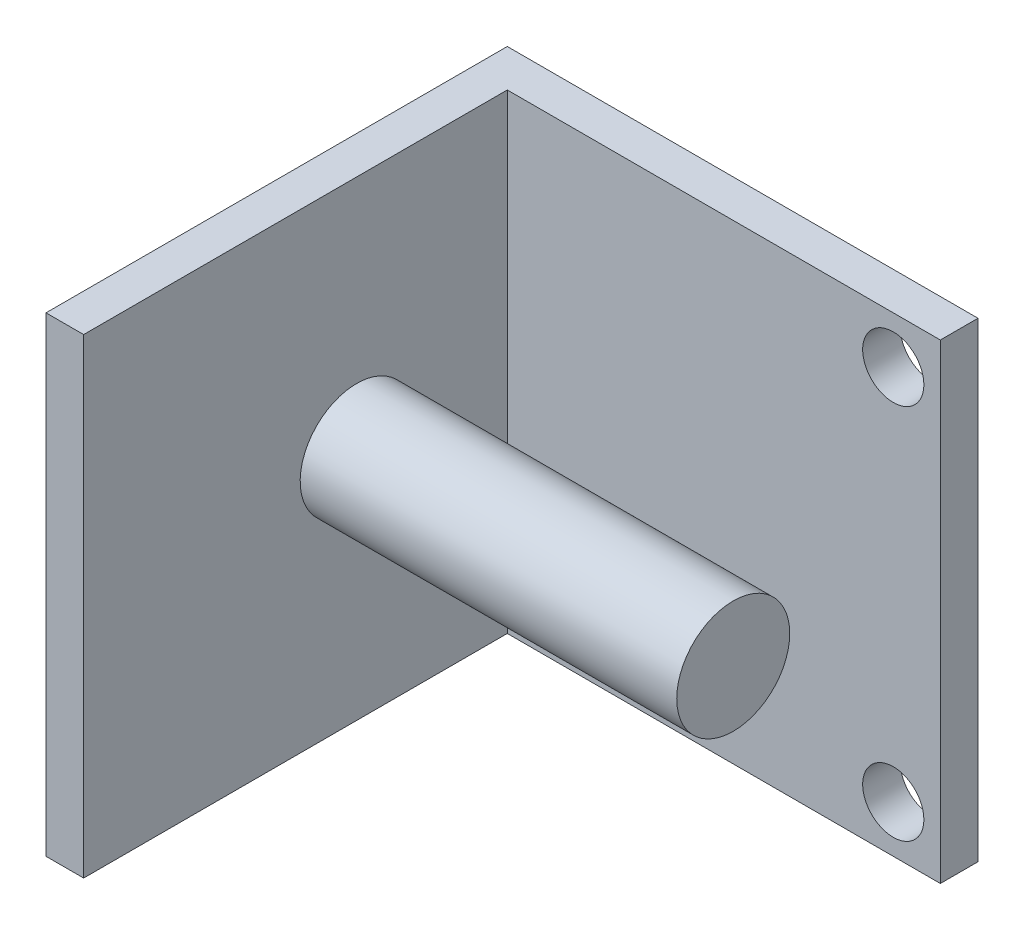
ISO-10303-21;
HEADER;
FILE_DESCRIPTION(('STEP AP214'),'2;1');
FILE_NAME('part.step','',(''),(''),'','','');
FILE_SCHEMA(('AUTOMOTIVE_DESIGN { 1 0 10303 214 1 1 1 1 }'));
ENDSEC;
DATA;
#1=APPLICATION_CONTEXT('core data for automotive mechanical design processes');
#2=APPLICATION_PROTOCOL_DEFINITION('international standard','automotive_design',2000,#1);
#3=PRODUCT_CONTEXT('',#1,'mechanical');
#4=PRODUCT('Part','Part','',(#3));
#5=PRODUCT_RELATED_PRODUCT_CATEGORY('part','',(#4));
#6=PRODUCT_DEFINITION_FORMATION('','',#4);
#7=PRODUCT_DEFINITION_CONTEXT('part definition',#1,'design');
#8=PRODUCT_DEFINITION('design','',#6,#7);
#9=PRODUCT_DEFINITION_SHAPE('','',#8);
#10=(LENGTH_UNIT() NAMED_UNIT(*) SI_UNIT(.MILLI.,.METRE.));
#11=(NAMED_UNIT(*) PLANE_ANGLE_UNIT() SI_UNIT($,.RADIAN.));
#12=(NAMED_UNIT(*) SI_UNIT($,.STERADIAN.) SOLID_ANGLE_UNIT());
#13=UNCERTAINTY_MEASURE_WITH_UNIT(LENGTH_MEASURE(1.E-05),#10,'distance_accuracy_value','');
#14=(GEOMETRIC_REPRESENTATION_CONTEXT(3) GLOBAL_UNCERTAINTY_ASSIGNED_CONTEXT((#13)) GLOBAL_UNIT_ASSIGNED_CONTEXT((#10,
#11,#12)) REPRESENTATION_CONTEXT('',''));
#15=CARTESIAN_POINT('',(0.,0.,0.));
#16=DIRECTION('',(0.,0.,1.));
#17=DIRECTION('',(1.,0.,0.));
#18=AXIS2_PLACEMENT_3D('',#15,#16,#17);
#19=CARTESIAN_POINT('',(-21.,25.,49.));
#20=DIRECTION('',(-1.,0.,0.));
#21=DIRECTION('',(0.,-1.,0.));
#22=AXIS2_PLACEMENT_3D('',#19,#20,#21);
#23=PLANE('',#22);
#24=DIRECTION('',(0.,1.,0.));
#25=VECTOR('',#24,1.);
#26=CARTESIAN_POINT('',(-21.,25.,4.));
#27=LINE('',#26,#25);
#28=CARTESIAN_POINT('',(-21.,-25.,4.));
#29=VERTEX_POINT('',#28);
#30=CARTESIAN_POINT('',(-21.,25.,4.));
#31=VERTEX_POINT('',#30);
#32=EDGE_CURVE('E52',#29,#31,#27,.T.);
#33=ORIENTED_EDGE('',*,*,#32,.T.);
#34=DIRECTION('',(0.,0.,-1.));
#35=VECTOR('',#34,1.);
#36=CARTESIAN_POINT('',(-21.,25.,49.));
#37=LINE('',#36,#35);
#38=CARTESIAN_POINT('',(-21.,25.,49.));
#39=VERTEX_POINT('',#38);
#40=EDGE_CURVE('E103',#39,#31,#37,.T.);
#41=ORIENTED_EDGE('',*,*,#40,.F.);
#42=DIRECTION('',(0.,1.,0.));
#43=VECTOR('',#42,1.);
#44=CARTESIAN_POINT('',(-21.,25.,49.));
#45=LINE('',#44,#43);
#46=CARTESIAN_POINT('',(-21.,-25.,49.));
#47=VERTEX_POINT('',#46);
#48=EDGE_CURVE('E123',#47,#39,#45,.T.);
#49=ORIENTED_EDGE('',*,*,#48,.F.);
#50=DIRECTION('',(0.,0.,-1.));
#51=VECTOR('',#50,1.);
#52=CARTESIAN_POINT('',(-21.,-25.,49.));
#53=LINE('',#52,#51);
#54=EDGE_CURVE('E99',#47,#29,#53,.T.);
#55=ORIENTED_EDGE('',*,*,#54,.T.);
#56=EDGE_LOOP('',(#33,#41,#49,#55));
#57=FACE_BOUND('',#56,.T.);
#58=CARTESIAN_POINT('',(-21.,0.,20.));
#59=DIRECTION('',(-1.,0.,0.));
#60=DIRECTION('',(0.,-1.,0.));
#61=AXIS2_PLACEMENT_3D('',#58,#59,#60);
#62=CIRCLE('',#61,6.);
#63=CARTESIAN_POINT('',(-21.,-6.,20.));
#64=VERTEX_POINT('',#63);
#65=EDGE_CURVE('E11',#64,#64,#62,.F.);
#66=ORIENTED_EDGE('',*,*,#65,.F.);
#67=EDGE_LOOP('',(#66));
#68=FACE_BOUND('',#67,.T.);
#69=ADVANCED_FACE('F35',(#57,#68),#23,.F.);
#70=CARTESIAN_POINT('',(25.,25.,4.));
#71=DIRECTION('',(-1.,0.,0.));
#72=DIRECTION('',(0.,-1.,0.));
#73=AXIS2_PLACEMENT_3D('',#70,#71,#72);
#74=PLANE('',#73);
#75=DIRECTION('',(0.,1.,0.));
#76=VECTOR('',#75,1.);
#77=CARTESIAN_POINT('',(25.,25.,0.));
#78=LINE('',#77,#76);
#79=CARTESIAN_POINT('',(25.,-25.,0.));
#80=VERTEX_POINT('',#79);
#81=CARTESIAN_POINT('',(25.,25.,0.));
#82=VERTEX_POINT('',#81);
#83=EDGE_CURVE('E94',#80,#82,#78,.T.);
#84=ORIENTED_EDGE('',*,*,#83,.T.);
#85=DIRECTION('',(0.,0.,-1.));
#86=VECTOR('',#85,1.);
#87=CARTESIAN_POINT('',(25.,25.,4.));
#88=LINE('',#87,#86);
#89=CARTESIAN_POINT('',(25.,25.,4.));
#90=VERTEX_POINT('',#89);
#91=EDGE_CURVE('E44',#90,#82,#88,.T.);
#92=ORIENTED_EDGE('',*,*,#91,.F.);
#93=DIRECTION('',(0.,1.,0.));
#94=VECTOR('',#93,1.);
#95=CARTESIAN_POINT('',(25.,25.,4.));
#96=LINE('',#95,#94);
#97=CARTESIAN_POINT('',(25.,-25.,4.));
#98=VERTEX_POINT('',#97);
#99=EDGE_CURVE('E88',#98,#90,#96,.T.);
#100=ORIENTED_EDGE('',*,*,#99,.F.);
#101=DIRECTION('',(0.,0.,-1.));
#102=VECTOR('',#101,1.);
#103=CARTESIAN_POINT('',(25.,-25.,4.));
#104=LINE('',#103,#102);
#105=EDGE_CURVE('E80',#98,#80,#104,.T.);
#106=ORIENTED_EDGE('',*,*,#105,.T.);
#107=EDGE_LOOP('',(#84,#92,#100,#106));
#108=FACE_BOUND('',#107,.T.);
#109=ADVANCED_FACE('F37',(#108),#74,.F.);
#110=CARTESIAN_POINT('',(-25.,25.,4.));
#111=DIRECTION('',(0.,-1.,0.));
#112=DIRECTION('',(0.,0.,-1.));
#113=AXIS2_PLACEMENT_3D('',#110,#111,#112);
#114=PLANE('',#113);
#115=DIRECTION('',(-1.,0.,0.));
#116=VECTOR('',#115,1.);
#117=CARTESIAN_POINT('',(-25.,25.,0.));
#118=LINE('',#117,#116);
#119=CARTESIAN_POINT('',(-25.,25.,0.));
#120=VERTEX_POINT('',#119);
#121=EDGE_CURVE('E97',#82,#120,#118,.T.);
#122=ORIENTED_EDGE('',*,*,#121,.T.);
#123=DIRECTION('',(0.,0.,-1.));
#124=VECTOR('',#123,1.);
#125=CARTESIAN_POINT('',(-25.,25.,4.));
#126=LINE('',#125,#124);
#127=CARTESIAN_POINT('',(-25.,25.,49.));
#128=VERTEX_POINT('',#127);
#129=EDGE_CURVE('E111',#128,#120,#126,.T.);
#130=ORIENTED_EDGE('',*,*,#129,.F.);
#131=DIRECTION('',(-1.,0.,0.));
#132=VECTOR('',#131,1.);
#133=CARTESIAN_POINT('',(-21.,25.,49.));
#134=LINE('',#133,#132);
#135=EDGE_CURVE('E126',#39,#128,#134,.T.);
#136=ORIENTED_EDGE('',*,*,#135,.F.);
#137=ORIENTED_EDGE('',*,*,#40,.T.);
#138=DIRECTION('',(-1.,0.,0.));
#139=VECTOR('',#138,1.);
#140=CARTESIAN_POINT('',(-25.,25.,4.));
#141=LINE('',#140,#139);
#142=EDGE_CURVE('E115',#90,#31,#141,.T.);
#143=ORIENTED_EDGE('',*,*,#142,.F.);
#144=ORIENTED_EDGE('',*,*,#91,.T.);
#145=EDGE_LOOP('',(#122,#130,#136,#137,#143,#144));
#146=FACE_BOUND('',#145,.T.);
#147=ADVANCED_FACE('F169',(#146),#114,.F.);
#148=CARTESIAN_POINT('',(-25.,25.,4.));
#149=DIRECTION('',(1.,0.,0.));
#150=DIRECTION('',(0.,1.,0.));
#151=AXIS2_PLACEMENT_3D('',#148,#149,#150);
#152=PLANE('',#151);
#153=DIRECTION('',(0.,-1.,0.));
#154=VECTOR('',#153,1.);
#155=CARTESIAN_POINT('',(-25.,25.,0.));
#156=LINE('',#155,#154);
#157=CARTESIAN_POINT('',(-25.,-25.,0.));
#158=VERTEX_POINT('',#157);
#159=EDGE_CURVE('E89',#120,#158,#156,.T.);
#160=ORIENTED_EDGE('',*,*,#159,.T.);
#161=DIRECTION('',(0.,0.,-1.));
#162=VECTOR('',#161,1.);
#163=CARTESIAN_POINT('',(-25.,-25.,4.));
#164=LINE('',#163,#162);
#165=CARTESIAN_POINT('',(-25.,-25.,49.));
#166=VERTEX_POINT('',#165);
#167=EDGE_CURVE('E84',#166,#158,#164,.T.);
#168=ORIENTED_EDGE('',*,*,#167,.F.);
#169=DIRECTION('',(0.,-1.,0.));
#170=VECTOR('',#169,1.);
#171=CARTESIAN_POINT('',(-25.,25.,49.));
#172=LINE('',#171,#170);
#173=EDGE_CURVE('E150',#128,#166,#172,.T.);
#174=ORIENTED_EDGE('',*,*,#173,.F.);
#175=ORIENTED_EDGE('',*,*,#129,.T.);
#176=EDGE_LOOP('',(#160,#168,#174,#175));
#177=FACE_BOUND('',#176,.T.);
#178=ADVANCED_FACE('F174',(#177),#152,.F.);
#179=CARTESIAN_POINT('',(-25.,-25.,4.));
#180=DIRECTION('',(0.,1.,0.));
#181=DIRECTION('',(0.,0.,1.));
#182=AXIS2_PLACEMENT_3D('',#179,#180,#181);
#183=PLANE('',#182);
#184=DIRECTION('',(1.,0.,0.));
#185=VECTOR('',#184,1.);
#186=CARTESIAN_POINT('',(-25.,-25.,0.));
#187=LINE('',#186,#185);
#188=EDGE_CURVE('E77',#158,#80,#187,.T.);
#189=ORIENTED_EDGE('',*,*,#188,.T.);
#190=ORIENTED_EDGE('',*,*,#105,.F.);
#191=DIRECTION('',(1.,0.,0.));
#192=VECTOR('',#191,1.);
#193=CARTESIAN_POINT('',(-25.,-25.,4.));
#194=LINE('',#193,#192);
#195=EDGE_CURVE('E57',#29,#98,#194,.T.);
#196=ORIENTED_EDGE('',*,*,#195,.F.);
#197=ORIENTED_EDGE('',*,*,#54,.F.);
#198=DIRECTION('',(1.,0.,0.));
#199=VECTOR('',#198,1.);
#200=CARTESIAN_POINT('',(-25.,-25.,49.));
#201=LINE('',#200,#199);
#202=EDGE_CURVE('E152',#166,#47,#201,.T.);
#203=ORIENTED_EDGE('',*,*,#202,.F.);
#204=ORIENTED_EDGE('',*,*,#167,.T.);
#205=EDGE_LOOP('',(#189,#190,#196,#197,#203,#204));
#206=FACE_BOUND('',#205,.T.);
#207=ADVANCED_FACE('F79',(#206),#183,.F.);
#208=CARTESIAN_POINT('',(0.,0.,4.));
#209=DIRECTION('',(0.,0.,1.));
#210=DIRECTION('',(1.,0.,0.));
#211=AXIS2_PLACEMENT_3D('',#208,#209,#210);
#212=PLANE('',#211);
#213=CARTESIAN_POINT('',(20.0000000000017,-19.9999999999984,4.));
#214=DIRECTION('',(0.,0.,1.));
#215=DIRECTION('',(1.,0.,0.));
#216=AXIS2_PLACEMENT_3D('',#213,#214,#215);
#217=CIRCLE('',#216,3.25000000000107);
#218=CARTESIAN_POINT('',(23.2500000000028,-19.9999999999984,4.));
#219=VERTEX_POINT('',#218);
#220=EDGE_CURVE('E145',#219,#219,#217,.T.);
#221=ORIENTED_EDGE('',*,*,#220,.F.);
#222=EDGE_LOOP('',(#221));
#223=FACE_BOUND('',#222,.T.);
#224=CARTESIAN_POINT('',(20.,20.,4.));
#225=DIRECTION('',(0.,0.,1.));
#226=DIRECTION('',(1.,0.,0.));
#227=AXIS2_PLACEMENT_3D('',#224,#225,#226);
#228=CIRCLE('',#227,3.25);
#229=CARTESIAN_POINT('',(23.25,20.,4.));
#230=VERTEX_POINT('',#229);
#231=EDGE_CURVE('E135',#230,#230,#228,.T.);
#232=ORIENTED_EDGE('',*,*,#231,.F.);
#233=EDGE_LOOP('',(#232));
#234=FACE_BOUND('',#233,.T.);
#235=ORIENTED_EDGE('',*,*,#32,.F.);
#236=ORIENTED_EDGE('',*,*,#195,.T.);
#237=ORIENTED_EDGE('',*,*,#99,.T.);
#238=ORIENTED_EDGE('',*,*,#142,.T.);
#239=EDGE_LOOP('',(#235,#236,#237,#238));
#240=FACE_BOUND('',#239,.T.);
#241=ADVANCED_FACE('F177',(#223,#234,#240),#212,.T.);
#242=CARTESIAN_POINT('',(0.,0.,0.));
#243=DIRECTION('',(0.,0.,1.));
#244=DIRECTION('',(1.,0.,0.));
#245=AXIS2_PLACEMENT_3D('',#242,#243,#244);
#246=PLANE('',#245);
#247=CARTESIAN_POINT('',(20.0000000000017,-19.9999999999984,0.));
#248=DIRECTION('',(0.,0.,1.));
#249=DIRECTION('',(1.,0.,0.));
#250=AXIS2_PLACEMENT_3D('',#247,#248,#249);
#251=CIRCLE('',#250,3.25000000000107);
#252=CARTESIAN_POINT('',(23.2500000000028,-19.9999999999984,0.));
#253=VERTEX_POINT('',#252);
#254=EDGE_CURVE('E39',#253,#253,#251,.T.);
#255=ORIENTED_EDGE('',*,*,#254,.T.);
#256=EDGE_LOOP('',(#255));
#257=FACE_BOUND('',#256,.T.);
#258=CARTESIAN_POINT('',(20.,20.,0.));
#259=DIRECTION('',(0.,0.,1.));
#260=DIRECTION('',(1.,0.,0.));
#261=AXIS2_PLACEMENT_3D('',#258,#259,#260);
#262=CIRCLE('',#261,3.25);
#263=CARTESIAN_POINT('',(23.25,20.,0.));
#264=VERTEX_POINT('',#263);
#265=EDGE_CURVE('E133',#264,#264,#262,.T.);
#266=ORIENTED_EDGE('',*,*,#265,.T.);
#267=EDGE_LOOP('',(#266));
#268=FACE_BOUND('',#267,.T.);
#269=ORIENTED_EDGE('',*,*,#83,.F.);
#270=ORIENTED_EDGE('',*,*,#188,.F.);
#271=ORIENTED_EDGE('',*,*,#159,.F.);
#272=ORIENTED_EDGE('',*,*,#121,.F.);
#273=EDGE_LOOP('',(#269,#270,#271,#272));
#274=FACE_BOUND('',#273,.T.);
#275=ADVANCED_FACE('F96',(#257,#268,#274),#246,.F.);
#276=CARTESIAN_POINT('',(0.,0.,49.));
#277=DIRECTION('',(0.,0.,1.));
#278=DIRECTION('',(1.,0.,0.));
#279=AXIS2_PLACEMENT_3D('',#276,#277,#278);
#280=PLANE('',#279);
#281=ORIENTED_EDGE('',*,*,#135,.T.);
#282=ORIENTED_EDGE('',*,*,#173,.T.);
#283=ORIENTED_EDGE('',*,*,#202,.T.);
#284=ORIENTED_EDGE('',*,*,#48,.T.);
#285=EDGE_LOOP('',(#281,#282,#283,#284));
#286=FACE_BOUND('',#285,.T.);
#287=ADVANCED_FACE('F160',(#286),#280,.T.);
#288=CARTESIAN_POINT('',(19.,0.,20.));
#289=DIRECTION('',(-1.,0.,0.));
#290=DIRECTION('',(0.,-1.,0.));
#291=AXIS2_PLACEMENT_3D('',#288,#289,#290);
#292=CYLINDRICAL_SURFACE('',#291,6.);
#293=CARTESIAN_POINT('',(19.,0.,20.));
#294=DIRECTION('',(1.,0.,0.));
#295=DIRECTION('',(0.,1.,0.));
#296=AXIS2_PLACEMENT_3D('',#293,#294,#295);
#297=CIRCLE('',#296,6.);
#298=CARTESIAN_POINT('',(19.,6.00000000000001,20.));
#299=VERTEX_POINT('',#298);
#300=EDGE_CURVE('E127',#299,#299,#297,.T.);
#301=ORIENTED_EDGE('',*,*,#300,.F.);
#302=EDGE_LOOP('',(#301));
#303=FACE_BOUND('',#302,.T.);
#304=ORIENTED_EDGE('',*,*,#65,.T.);
#305=EDGE_LOOP('',(#304));
#306=FACE_BOUND('',#305,.T.);
#307=ADVANCED_FACE('F198',(#303,#306),#292,.T.);
#308=CARTESIAN_POINT('',(19.,0.,20.));
#309=DIRECTION('',(1.,0.,0.));
#310=DIRECTION('',(0.,1.,0.));
#311=AXIS2_PLACEMENT_3D('',#308,#309,#310);
#312=PLANE('',#311);
#313=ORIENTED_EDGE('',*,*,#300,.T.);
#314=EDGE_LOOP('',(#313));
#315=FACE_BOUND('',#314,.T.);
#316=ADVANCED_FACE('F201',(#315),#312,.T.);
#317=CARTESIAN_POINT('',(20.,20.,-36.));
#318=DIRECTION('',(0.,0.,1.));
#319=DIRECTION('',(1.,0.,0.));
#320=AXIS2_PLACEMENT_3D('',#317,#318,#319);
#321=CYLINDRICAL_SURFACE('',#320,3.25);
#322=ORIENTED_EDGE('',*,*,#231,.T.);
#323=EDGE_LOOP('',(#322));
#324=FACE_BOUND('',#323,.T.);
#325=ORIENTED_EDGE('',*,*,#265,.F.);
#326=EDGE_LOOP('',(#325));
#327=FACE_BOUND('',#326,.T.);
#328=ADVANCED_FACE('F205',(#324,#327),#321,.F.);
#329=CARTESIAN_POINT('',(20.0000000000017,-19.9999999999984,-36.));
#330=DIRECTION('',(0.,0.,1.));
#331=DIRECTION('',(1.,0.,0.));
#332=AXIS2_PLACEMENT_3D('',#329,#330,#331);
#333=CYLINDRICAL_SURFACE('',#332,3.25000000000107);
#334=ORIENTED_EDGE('',*,*,#220,.T.);
#335=EDGE_LOOP('',(#334));
#336=FACE_BOUND('',#335,.T.);
#337=ORIENTED_EDGE('',*,*,#254,.F.);
#338=EDGE_LOOP('',(#337));
#339=FACE_BOUND('',#338,.T.);
#340=ADVANCED_FACE('F209',(#336,#339),#333,.F.);
#341=CLOSED_SHELL('',(#69,#109,#147,#178,#207,#241,#275,#287,#307,#316,#328,#340));
#342=MANIFOLD_SOLID_BREP('B2',#341);
#343=ADVANCED_BREP_SHAPE_REPRESENTATION('',(#18,#342),#14);
#344=SHAPE_DEFINITION_REPRESENTATION(#9,#343);
ENDSEC;
END-ISO-10303-21;
